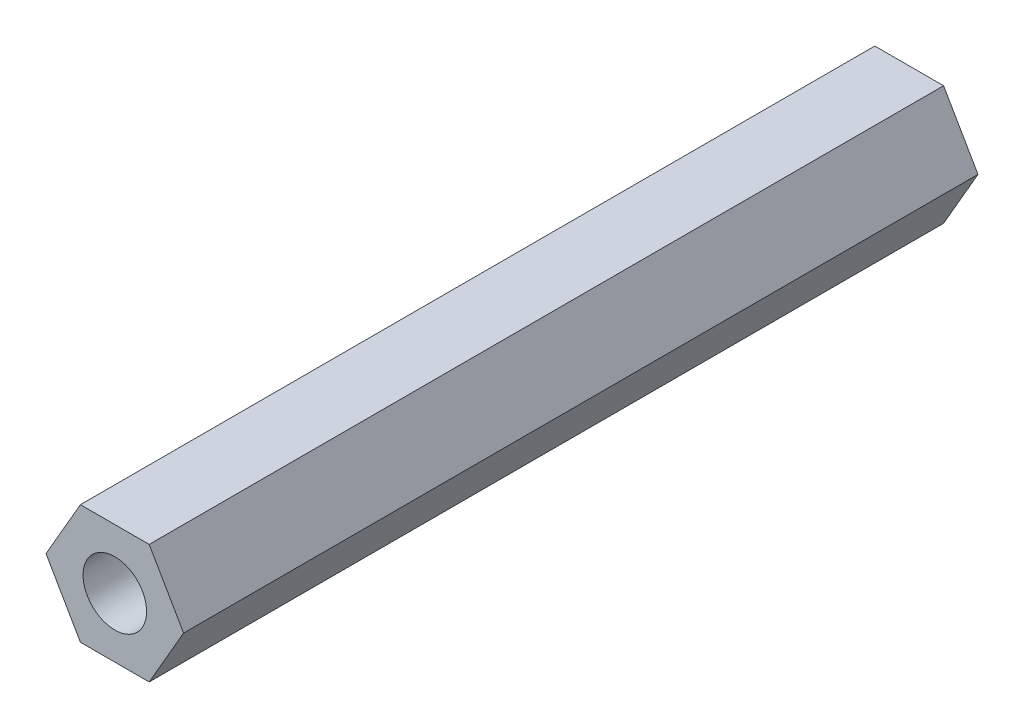
ISO-10303-21;
HEADER;
FILE_DESCRIPTION(('STEP AP214'),'2;1');
FILE_NAME('part.step','',(''),(''),'','','');
FILE_SCHEMA(('AUTOMOTIVE_DESIGN { 1 0 10303 214 1 1 1 1 }'));
ENDSEC;
DATA;
#1=APPLICATION_CONTEXT('core data for automotive mechanical design processes');
#2=APPLICATION_PROTOCOL_DEFINITION('international standard','automotive_design',2000,#1);
#3=PRODUCT_CONTEXT('',#1,'mechanical');
#4=PRODUCT('Part','Part','',(#3));
#5=PRODUCT_RELATED_PRODUCT_CATEGORY('part','',(#4));
#6=PRODUCT_DEFINITION_FORMATION('','',#4);
#7=PRODUCT_DEFINITION_CONTEXT('part definition',#1,'design');
#8=PRODUCT_DEFINITION('design','',#6,#7);
#9=PRODUCT_DEFINITION_SHAPE('','',#8);
#10=(LENGTH_UNIT() NAMED_UNIT(*) SI_UNIT(.MILLI.,.METRE.));
#11=(NAMED_UNIT(*) PLANE_ANGLE_UNIT() SI_UNIT($,.RADIAN.));
#12=(NAMED_UNIT(*) SI_UNIT($,.STERADIAN.) SOLID_ANGLE_UNIT());
#13=UNCERTAINTY_MEASURE_WITH_UNIT(LENGTH_MEASURE(1.E-05),#10,'distance_accuracy_value','');
#14=(GEOMETRIC_REPRESENTATION_CONTEXT(3) GLOBAL_UNCERTAINTY_ASSIGNED_CONTEXT((#13)) GLOBAL_UNIT_ASSIGNED_CONTEXT((#10,
#11,#12)) REPRESENTATION_CONTEXT('',''));
#15=CARTESIAN_POINT('',(0.,0.,0.));
#16=DIRECTION('',(0.,0.,1.));
#17=DIRECTION('',(1.,0.,0.));
#18=AXIS2_PLACEMENT_3D('',#15,#16,#17);
#19=CARTESIAN_POINT('',(0.,0.,40.));
#20=DIRECTION('',(0.,0.,1.));
#21=DIRECTION('',(1.,0.,0.));
#22=AXIS2_PLACEMENT_3D('',#19,#20,#21);
#23=PLANE('',#22);
#24=DIRECTION('',(1.,0.,0.));
#25=VECTOR('',#24,1.);
#26=CARTESIAN_POINT('',(-1.73205080756888,-3.,40.));
#27=LINE('',#26,#25);
#28=CARTESIAN_POINT('',(-1.73205080756888,-3.,40.));
#29=VERTEX_POINT('',#28);
#30=CARTESIAN_POINT('',(1.73205080756888,-3.,40.));
#31=VERTEX_POINT('',#30);
#32=EDGE_CURVE('E128',#29,#31,#27,.T.);
#33=ORIENTED_EDGE('',*,*,#32,.T.);
#34=DIRECTION('',(0.5,0.866025403784439,0.));
#35=VECTOR('',#34,1.);
#36=CARTESIAN_POINT('',(1.73205080756888,-3.,40.));
#37=LINE('',#36,#35);
#38=CARTESIAN_POINT('',(3.46410161513776,0.,40.));
#39=VERTEX_POINT('',#38);
#40=EDGE_CURVE('E86',#31,#39,#37,.T.);
#41=ORIENTED_EDGE('',*,*,#40,.T.);
#42=DIRECTION('',(-0.5,0.866025403784439,0.));
#43=VECTOR('',#42,1.);
#44=CARTESIAN_POINT('',(3.46410161513776,0.,40.));
#45=LINE('',#44,#43);
#46=CARTESIAN_POINT('',(1.73205080756888,3.,40.));
#47=VERTEX_POINT('',#46);
#48=EDGE_CURVE('E99',#39,#47,#45,.T.);
#49=ORIENTED_EDGE('',*,*,#48,.T.);
#50=DIRECTION('',(-1.,0.,0.));
#51=VECTOR('',#50,1.);
#52=CARTESIAN_POINT('',(1.73205080756888,3.,40.));
#53=LINE('',#52,#51);
#54=CARTESIAN_POINT('',(-1.73205080756888,3.,40.));
#55=VERTEX_POINT('',#54);
#56=EDGE_CURVE('E93',#47,#55,#53,.T.);
#57=ORIENTED_EDGE('',*,*,#56,.T.);
#58=DIRECTION('',(-0.5,-0.866025403784439,0.));
#59=VECTOR('',#58,1.);
#60=CARTESIAN_POINT('',(-1.73205080756888,3.,40.));
#61=LINE('',#60,#59);
#62=CARTESIAN_POINT('',(-3.46410161513776,0.,40.));
#63=VERTEX_POINT('',#62);
#64=EDGE_CURVE('E97',#55,#63,#61,.T.);
#65=ORIENTED_EDGE('',*,*,#64,.T.);
#66=DIRECTION('',(0.5,-0.866025403784439,0.));
#67=VECTOR('',#66,1.);
#68=CARTESIAN_POINT('',(-3.46410161513776,0.,40.));
#69=LINE('',#68,#67);
#70=EDGE_CURVE('E49',#63,#29,#69,.T.);
#71=ORIENTED_EDGE('',*,*,#70,.T.);
#72=EDGE_LOOP('',(#33,#41,#49,#57,#65,#71));
#73=FACE_BOUND('',#72,.T.);
#74=CARTESIAN_POINT('',(0.,0.,40.));
#75=DIRECTION('',(0.,0.,1.));
#76=DIRECTION('',(1.,0.,0.));
#77=AXIS2_PLACEMENT_3D('',#74,#75,#76);
#78=CIRCLE('',#77,1.6);
#79=CARTESIAN_POINT('',(1.6,0.,40.));
#80=VERTEX_POINT('',#79);
#81=EDGE_CURVE('E121',#80,#80,#78,.T.);
#82=ORIENTED_EDGE('',*,*,#81,.F.);
#83=EDGE_LOOP('',(#82));
#84=FACE_BOUND('',#83,.T.);
#85=ADVANCED_FACE('F32',(#73,#84),#23,.T.);
#86=CARTESIAN_POINT('',(0.,0.,0.));
#87=DIRECTION('',(0.,0.,1.));
#88=DIRECTION('',(1.,0.,0.));
#89=AXIS2_PLACEMENT_3D('',#86,#87,#88);
#90=PLANE('',#89);
#91=DIRECTION('',(1.,0.,0.));
#92=VECTOR('',#91,1.);
#93=CARTESIAN_POINT('',(-1.73205080756888,-3.,0.));
#94=LINE('',#93,#92);
#95=CARTESIAN_POINT('',(-1.73205080756888,-3.,0.));
#96=VERTEX_POINT('',#95);
#97=CARTESIAN_POINT('',(1.73205080756888,-3.,0.));
#98=VERTEX_POINT('',#97);
#99=EDGE_CURVE('E117',#96,#98,#94,.T.);
#100=ORIENTED_EDGE('',*,*,#99,.F.);
#101=DIRECTION('',(0.5,-0.866025403784439,0.));
#102=VECTOR('',#101,1.);
#103=CARTESIAN_POINT('',(-3.46410161513776,0.,0.));
#104=LINE('',#103,#102);
#105=CARTESIAN_POINT('',(-3.46410161513776,0.,0.));
#106=VERTEX_POINT('',#105);
#107=EDGE_CURVE('E78',#106,#96,#104,.T.);
#108=ORIENTED_EDGE('',*,*,#107,.F.);
#109=DIRECTION('',(-0.5,-0.866025403784439,0.));
#110=VECTOR('',#109,1.);
#111=CARTESIAN_POINT('',(-1.73205080756888,3.,0.));
#112=LINE('',#111,#110);
#113=CARTESIAN_POINT('',(-1.73205080756888,3.,0.));
#114=VERTEX_POINT('',#113);
#115=EDGE_CURVE('E72',#114,#106,#112,.T.);
#116=ORIENTED_EDGE('',*,*,#115,.F.);
#117=DIRECTION('',(-1.,0.,0.));
#118=VECTOR('',#117,1.);
#119=CARTESIAN_POINT('',(1.73205080756888,3.,0.));
#120=LINE('',#119,#118);
#121=CARTESIAN_POINT('',(1.73205080756888,3.,0.));
#122=VERTEX_POINT('',#121);
#123=EDGE_CURVE('E107',#122,#114,#120,.T.);
#124=ORIENTED_EDGE('',*,*,#123,.F.);
#125=DIRECTION('',(-0.5,0.866025403784439,0.));
#126=VECTOR('',#125,1.);
#127=CARTESIAN_POINT('',(3.46410161513776,0.,0.));
#128=LINE('',#127,#126);
#129=CARTESIAN_POINT('',(3.46410161513776,0.,0.));
#130=VERTEX_POINT('',#129);
#131=EDGE_CURVE('E123',#130,#122,#128,.T.);
#132=ORIENTED_EDGE('',*,*,#131,.F.);
#133=DIRECTION('',(0.5,0.866025403784439,0.));
#134=VECTOR('',#133,1.);
#135=CARTESIAN_POINT('',(1.73205080756888,-3.,0.));
#136=LINE('',#135,#134);
#137=EDGE_CURVE('E120',#98,#130,#136,.T.);
#138=ORIENTED_EDGE('',*,*,#137,.F.);
#139=EDGE_LOOP('',(#100,#108,#116,#124,#132,#138));
#140=FACE_BOUND('',#139,.T.);
#141=CARTESIAN_POINT('',(0.,0.,0.));
#142=DIRECTION('',(0.,0.,1.));
#143=DIRECTION('',(1.,0.,0.));
#144=AXIS2_PLACEMENT_3D('',#141,#142,#143);
#145=CIRCLE('',#144,1.6);
#146=CARTESIAN_POINT('',(1.6,0.,0.));
#147=VERTEX_POINT('',#146);
#148=EDGE_CURVE('E221',#147,#147,#145,.T.);
#149=ORIENTED_EDGE('',*,*,#148,.T.);
#150=EDGE_LOOP('',(#149));
#151=FACE_BOUND('',#150,.T.);
#152=ADVANCED_FACE('F137',(#140,#151),#90,.F.);
#153=CARTESIAN_POINT('',(-1.73205080756888,-3.,40.));
#154=DIRECTION('',(0.,1.,0.));
#155=DIRECTION('',(0.,0.,1.));
#156=AXIS2_PLACEMENT_3D('',#153,#154,#155);
#157=PLANE('',#156);
#158=ORIENTED_EDGE('',*,*,#99,.T.);
#159=DIRECTION('',(0.,0.,-1.));
#160=VECTOR('',#159,1.);
#161=CARTESIAN_POINT('',(1.73205080756888,-3.,40.));
#162=LINE('',#161,#160);
#163=EDGE_CURVE('E11',#31,#98,#162,.T.);
#164=ORIENTED_EDGE('',*,*,#163,.F.);
#165=ORIENTED_EDGE('',*,*,#32,.F.);
#166=DIRECTION('',(0.,0.,-1.));
#167=VECTOR('',#166,1.);
#168=CARTESIAN_POINT('',(-1.73205080756888,-3.,40.));
#169=LINE('',#168,#167);
#170=EDGE_CURVE('E113',#29,#96,#169,.T.);
#171=ORIENTED_EDGE('',*,*,#170,.T.);
#172=EDGE_LOOP('',(#158,#164,#165,#171));
#173=FACE_BOUND('',#172,.T.);
#174=ADVANCED_FACE('F34',(#173),#157,.F.);
#175=CARTESIAN_POINT('',(1.73205080756888,-3.,40.));
#176=DIRECTION('',(-0.866025403784438,0.5,0.));
#177=DIRECTION('',(-0.5,-0.866025403784439,0.));
#178=AXIS2_PLACEMENT_3D('',#175,#176,#177);
#179=PLANE('',#178);
#180=ORIENTED_EDGE('',*,*,#137,.T.);
#181=DIRECTION('',(0.,0.,-1.));
#182=VECTOR('',#181,1.);
#183=CARTESIAN_POINT('',(3.46410161513776,0.,40.));
#184=LINE('',#183,#182);
#185=EDGE_CURVE('E41',#39,#130,#184,.T.);
#186=ORIENTED_EDGE('',*,*,#185,.F.);
#187=ORIENTED_EDGE('',*,*,#40,.F.);
#188=ORIENTED_EDGE('',*,*,#163,.T.);
#189=EDGE_LOOP('',(#180,#186,#187,#188));
#190=FACE_BOUND('',#189,.T.);
#191=ADVANCED_FACE('F162',(#190),#179,.F.);
#192=CARTESIAN_POINT('',(3.46410161513776,0.,40.));
#193=DIRECTION('',(-0.866025403784439,-0.5,0.));
#194=DIRECTION('',(0.5,-0.866025403784439,0.));
#195=AXIS2_PLACEMENT_3D('',#192,#193,#194);
#196=PLANE('',#195);
#197=ORIENTED_EDGE('',*,*,#131,.T.);
#198=DIRECTION('',(0.,0.,-1.));
#199=VECTOR('',#198,1.);
#200=CARTESIAN_POINT('',(1.73205080756888,3.,40.));
#201=LINE('',#200,#199);
#202=EDGE_CURVE('E108',#47,#122,#201,.T.);
#203=ORIENTED_EDGE('',*,*,#202,.F.);
#204=ORIENTED_EDGE('',*,*,#48,.F.);
#205=ORIENTED_EDGE('',*,*,#185,.T.);
#206=EDGE_LOOP('',(#197,#203,#204,#205));
#207=FACE_BOUND('',#206,.T.);
#208=ADVANCED_FACE('F134',(#207),#196,.F.);
#209=CARTESIAN_POINT('',(1.73205080756888,3.,40.));
#210=DIRECTION('',(0.,-1.,0.));
#211=DIRECTION('',(1.,0.,0.));
#212=AXIS2_PLACEMENT_3D('',#209,#210,#211);
#213=PLANE('',#212);
#214=ORIENTED_EDGE('',*,*,#123,.T.);
#215=DIRECTION('',(0.,0.,-1.));
#216=VECTOR('',#215,1.);
#217=CARTESIAN_POINT('',(-1.73205080756888,3.,40.));
#218=LINE('',#217,#216);
#219=EDGE_CURVE('E104',#55,#114,#218,.T.);
#220=ORIENTED_EDGE('',*,*,#219,.F.);
#221=ORIENTED_EDGE('',*,*,#56,.F.);
#222=ORIENTED_EDGE('',*,*,#202,.T.);
#223=EDGE_LOOP('',(#214,#220,#221,#222));
#224=FACE_BOUND('',#223,.T.);
#225=ADVANCED_FACE('F105',(#224),#213,.F.);
#226=CARTESIAN_POINT('',(-1.73205080756888,3.,40.));
#227=DIRECTION('',(0.866025403784439,-0.5,0.));
#228=DIRECTION('',(0.5,0.866025403784439,0.));
#229=AXIS2_PLACEMENT_3D('',#226,#227,#228);
#230=PLANE('',#229);
#231=ORIENTED_EDGE('',*,*,#115,.T.);
#232=DIRECTION('',(0.,0.,-1.));
#233=VECTOR('',#232,1.);
#234=CARTESIAN_POINT('',(-3.46410161513776,0.,40.));
#235=LINE('',#234,#233);
#236=EDGE_CURVE('E109',#63,#106,#235,.T.);
#237=ORIENTED_EDGE('',*,*,#236,.F.);
#238=ORIENTED_EDGE('',*,*,#64,.F.);
#239=ORIENTED_EDGE('',*,*,#219,.T.);
#240=EDGE_LOOP('',(#231,#237,#238,#239));
#241=FACE_BOUND('',#240,.T.);
#242=ADVANCED_FACE('F111',(#241),#230,.F.);
#243=CARTESIAN_POINT('',(-3.46410161513776,0.,40.));
#244=DIRECTION('',(0.866025403784439,0.5,0.));
#245=DIRECTION('',(-0.5,0.866025403784439,0.));
#246=AXIS2_PLACEMENT_3D('',#243,#244,#245);
#247=PLANE('',#246);
#248=ORIENTED_EDGE('',*,*,#107,.T.);
#249=ORIENTED_EDGE('',*,*,#170,.F.);
#250=ORIENTED_EDGE('',*,*,#70,.F.);
#251=ORIENTED_EDGE('',*,*,#236,.T.);
#252=EDGE_LOOP('',(#248,#249,#250,#251));
#253=FACE_BOUND('',#252,.T.);
#254=ADVANCED_FACE('F142',(#253),#247,.F.);
#255=CARTESIAN_POINT('',(0.,0.,40.));
#256=DIRECTION('',(0.,0.,-1.));
#257=DIRECTION('',(-1.,0.,0.));
#258=AXIS2_PLACEMENT_3D('',#255,#256,#257);
#259=CYLINDRICAL_SURFACE('',#258,1.6);
#260=ORIENTED_EDGE('',*,*,#81,.T.);
#261=EDGE_LOOP('',(#260));
#262=FACE_BOUND('',#261,.T.);
#263=ORIENTED_EDGE('',*,*,#148,.F.);
#264=EDGE_LOOP('',(#263));
#265=FACE_BOUND('',#264,.T.);
#266=ADVANCED_FACE('F144',(#262,#265),#259,.F.);
#267=CLOSED_SHELL('',(#85,#152,#174,#191,#208,#225,#242,#254,#266));
#268=MANIFOLD_SOLID_BREP('B2',#267);
#269=ADVANCED_BREP_SHAPE_REPRESENTATION('',(#18,#268),#14);
#270=SHAPE_DEFINITION_REPRESENTATION(#9,#269);
ENDSEC;
END-ISO-10303-21;
